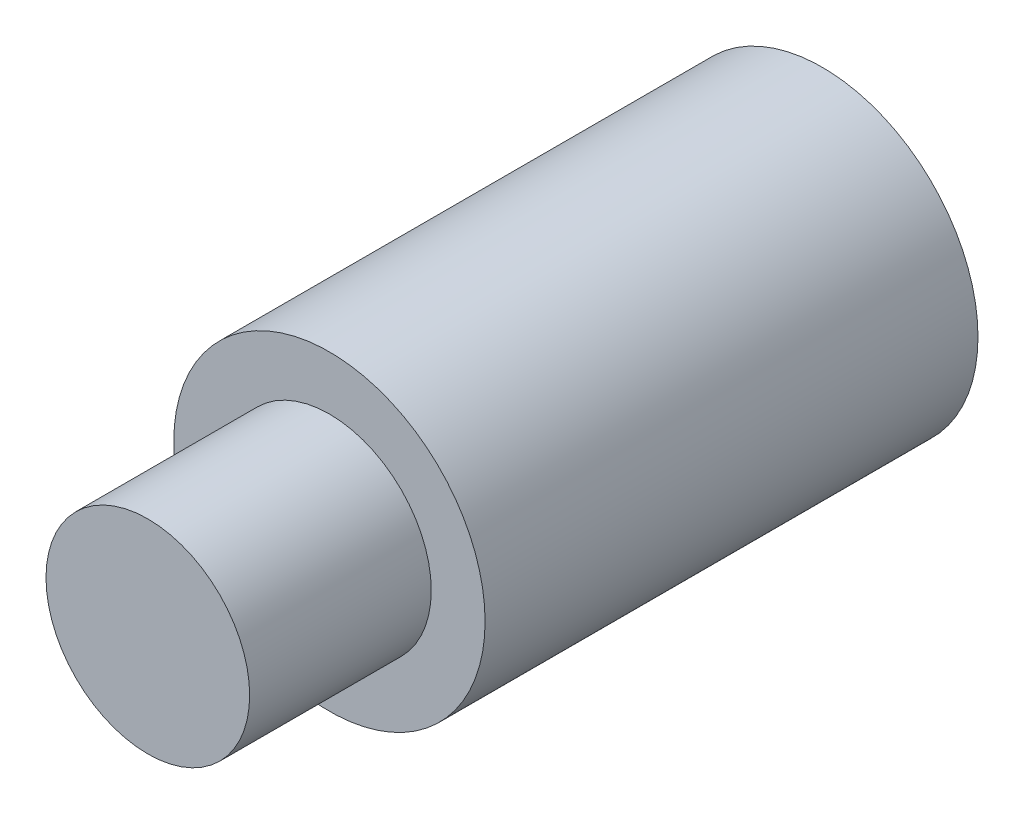
ISO-10303-21;
HEADER;
FILE_DESCRIPTION(('STEP AP214'),'2;1');
FILE_NAME('part.step','',(''),(''),'','','');
FILE_SCHEMA(('AUTOMOTIVE_DESIGN { 1 0 10303 214 1 1 1 1 }'));
ENDSEC;
DATA;
#1=APPLICATION_CONTEXT('core data for automotive mechanical design processes');
#2=APPLICATION_PROTOCOL_DEFINITION('international standard','automotive_design',2000,#1);
#3=PRODUCT_CONTEXT('',#1,'mechanical');
#4=PRODUCT('Part','Part','',(#3));
#5=PRODUCT_RELATED_PRODUCT_CATEGORY('part','',(#4));
#6=PRODUCT_DEFINITION_FORMATION('','',#4);
#7=PRODUCT_DEFINITION_CONTEXT('part definition',#1,'design');
#8=PRODUCT_DEFINITION('design','',#6,#7);
#9=PRODUCT_DEFINITION_SHAPE('','',#8);
#10=(LENGTH_UNIT() NAMED_UNIT(*) SI_UNIT(.MILLI.,.METRE.));
#11=(NAMED_UNIT(*) PLANE_ANGLE_UNIT() SI_UNIT($,.RADIAN.));
#12=(NAMED_UNIT(*) SI_UNIT($,.STERADIAN.) SOLID_ANGLE_UNIT());
#13=UNCERTAINTY_MEASURE_WITH_UNIT(LENGTH_MEASURE(1.E-05),#10,'distance_accuracy_value','');
#14=(GEOMETRIC_REPRESENTATION_CONTEXT(3) GLOBAL_UNCERTAINTY_ASSIGNED_CONTEXT((#13)) GLOBAL_UNIT_ASSIGNED_CONTEXT((#10,
#11,#12)) REPRESENTATION_CONTEXT('',''));
#15=CARTESIAN_POINT('',(0.,0.,0.));
#16=DIRECTION('',(0.,0.,1.));
#17=DIRECTION('',(1.,0.,0.));
#18=AXIS2_PLACEMENT_3D('',#15,#16,#17);
#19=CARTESIAN_POINT('',(0.,0.,19.));
#20=DIRECTION('',(0.,0.,-1.));
#21=DIRECTION('',(-1.,0.,0.));
#22=AXIS2_PLACEMENT_3D('',#19,#20,#21);
#23=CYLINDRICAL_SURFACE('',#22,6.);
#24=CARTESIAN_POINT('',(0.,0.,19.));
#25=DIRECTION('',(0.,0.,1.));
#26=DIRECTION('',(1.,0.,0.));
#27=AXIS2_PLACEMENT_3D('',#24,#25,#26);
#28=CIRCLE('',#27,6.);
#29=CARTESIAN_POINT('',(6.,0.,19.));
#30=VERTEX_POINT('',#29);
#31=EDGE_CURVE('E48',#30,#30,#28,.T.);
#32=ORIENTED_EDGE('',*,*,#31,.F.);
#33=EDGE_LOOP('',(#32));
#34=FACE_BOUND('',#33,.T.);
#35=CARTESIAN_POINT('',(0.,0.,0.));
#36=DIRECTION('',(0.,0.,1.));
#37=DIRECTION('',(1.,0.,0.));
#38=AXIS2_PLACEMENT_3D('',#35,#36,#37);
#39=CIRCLE('',#38,6.);
#40=CARTESIAN_POINT('',(6.,0.,0.));
#41=VERTEX_POINT('',#40);
#42=EDGE_CURVE('E44',#41,#41,#39,.T.);
#43=ORIENTED_EDGE('',*,*,#42,.T.);
#44=EDGE_LOOP('',(#43));
#45=FACE_BOUND('',#44,.T.);
#46=ADVANCED_FACE('F41',(#34,#45),#23,.T.);
#47=CARTESIAN_POINT('',(0.,0.,19.));
#48=DIRECTION('',(0.,0.,1.));
#49=DIRECTION('',(1.,0.,0.));
#50=AXIS2_PLACEMENT_3D('',#47,#48,#49);
#51=PLANE('',#50);
#52=CARTESIAN_POINT('',(0.,0.,19.));
#53=DIRECTION('',(0.,0.,1.));
#54=DIRECTION('',(1.,0.,0.));
#55=AXIS2_PLACEMENT_3D('',#52,#53,#54);
#56=CIRCLE('',#55,3.925);
#57=CARTESIAN_POINT('',(3.925,0.,19.));
#58=VERTEX_POINT('',#57);
#59=EDGE_CURVE('E10',#58,#58,#56,.T.);
#60=ORIENTED_EDGE('',*,*,#59,.F.);
#61=EDGE_LOOP('',(#60));
#62=FACE_BOUND('',#61,.T.);
#63=ORIENTED_EDGE('',*,*,#31,.T.);
#64=EDGE_LOOP('',(#63));
#65=FACE_BOUND('',#64,.T.);
#66=ADVANCED_FACE('F65',(#62,#65),#51,.T.);
#67=CARTESIAN_POINT('',(0.,0.,0.));
#68=DIRECTION('',(0.,0.,1.));
#69=DIRECTION('',(1.,0.,0.));
#70=AXIS2_PLACEMENT_3D('',#67,#68,#69);
#71=PLANE('',#70);
#72=ORIENTED_EDGE('',*,*,#42,.F.);
#73=EDGE_LOOP('',(#72));
#74=FACE_BOUND('',#73,.T.);
#75=ADVANCED_FACE('F62',(#74),#71,.F.);
#76=CARTESIAN_POINT('',(0.,0.,26.));
#77=DIRECTION('',(0.,0.,-1.));
#78=DIRECTION('',(-1.,0.,0.));
#79=AXIS2_PLACEMENT_3D('',#76,#77,#78);
#80=CYLINDRICAL_SURFACE('',#79,3.925);
#81=CARTESIAN_POINT('',(0.,0.,26.));
#82=DIRECTION('',(0.,0.,1.));
#83=DIRECTION('',(1.,0.,0.));
#84=AXIS2_PLACEMENT_3D('',#81,#82,#83);
#85=CIRCLE('',#84,3.925);
#86=CARTESIAN_POINT('',(3.925,0.,26.));
#87=VERTEX_POINT('',#86);
#88=EDGE_CURVE('E54',#87,#87,#85,.T.);
#89=ORIENTED_EDGE('',*,*,#88,.F.);
#90=EDGE_LOOP('',(#89));
#91=FACE_BOUND('',#90,.T.);
#92=ORIENTED_EDGE('',*,*,#59,.T.);
#93=EDGE_LOOP('',(#92));
#94=FACE_BOUND('',#93,.T.);
#95=ADVANCED_FACE('F64',(#91,#94),#80,.T.);
#96=CARTESIAN_POINT('',(0.,0.,26.));
#97=DIRECTION('',(0.,0.,1.));
#98=DIRECTION('',(1.,0.,0.));
#99=AXIS2_PLACEMENT_3D('',#96,#97,#98);
#100=PLANE('',#99);
#101=ORIENTED_EDGE('',*,*,#88,.T.);
#102=EDGE_LOOP('',(#101));
#103=FACE_BOUND('',#102,.T.);
#104=ADVANCED_FACE('F71',(#103),#100,.T.);
#105=CLOSED_SHELL('',(#46,#66,#75,#95,#104));
#106=MANIFOLD_SOLID_BREP('B2',#105);
#107=ADVANCED_BREP_SHAPE_REPRESENTATION('',(#18,#106),#14);
#108=SHAPE_DEFINITION_REPRESENTATION(#9,#107);
ENDSEC;
END-ISO-10303-21;
